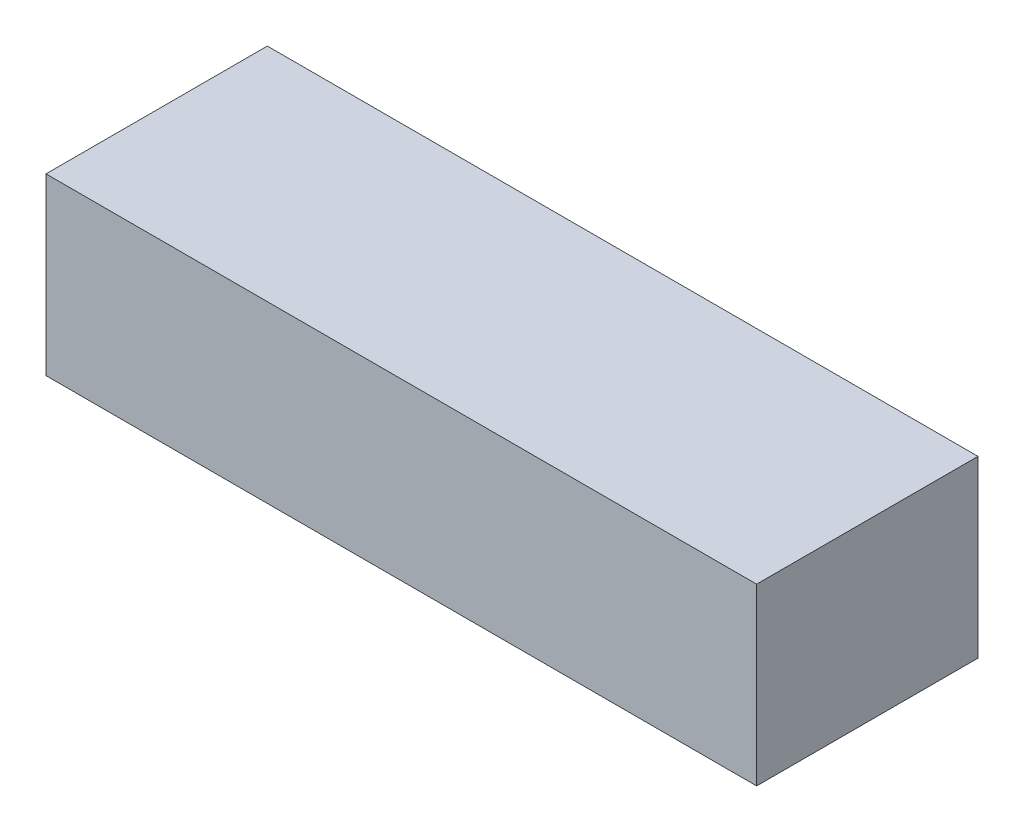
ISO-10303-21;
HEADER;
FILE_DESCRIPTION(('STEP AP214'),'2;1');
FILE_NAME('part.step','',(''),(''),'','','');
FILE_SCHEMA(('AUTOMOTIVE_DESIGN { 1 0 10303 214 1 1 1 1 }'));
ENDSEC;
DATA;
#1=APPLICATION_CONTEXT('core data for automotive mechanical design processes');
#2=APPLICATION_PROTOCOL_DEFINITION('international standard','automotive_design',2000,#1);
#3=PRODUCT_CONTEXT('',#1,'mechanical');
#4=PRODUCT('Part','Part','',(#3));
#5=PRODUCT_RELATED_PRODUCT_CATEGORY('part','',(#4));
#6=PRODUCT_DEFINITION_FORMATION('','',#4);
#7=PRODUCT_DEFINITION_CONTEXT('part definition',#1,'design');
#8=PRODUCT_DEFINITION('design','',#6,#7);
#9=PRODUCT_DEFINITION_SHAPE('','',#8);
#10=(LENGTH_UNIT() NAMED_UNIT(*) SI_UNIT(.MILLI.,.METRE.));
#11=(NAMED_UNIT(*) PLANE_ANGLE_UNIT() SI_UNIT($,.RADIAN.));
#12=(NAMED_UNIT(*) SI_UNIT($,.STERADIAN.) SOLID_ANGLE_UNIT());
#13=UNCERTAINTY_MEASURE_WITH_UNIT(LENGTH_MEASURE(1.E-05),#10,'distance_accuracy_value','');
#14=(GEOMETRIC_REPRESENTATION_CONTEXT(3) GLOBAL_UNCERTAINTY_ASSIGNED_CONTEXT((#13)) GLOBAL_UNIT_ASSIGNED_CONTEXT((#10,
#11,#12)) REPRESENTATION_CONTEXT('',''));
#15=CARTESIAN_POINT('',(0.,0.,0.));
#16=DIRECTION('',(0.,0.,1.));
#17=DIRECTION('',(1.,0.,0.));
#18=AXIS2_PLACEMENT_3D('',#15,#16,#17);
#19=CARTESIAN_POINT('',(61.,7.5,-9.5));
#20=DIRECTION('',(0.,0.,1.));
#21=DIRECTION('',(1.,0.,0.));
#22=AXIS2_PLACEMENT_3D('',#19,#20,#21);
#23=PLANE('',#22);
#24=DIRECTION('',(0.,1.,0.));
#25=VECTOR('',#24,1.);
#26=CARTESIAN_POINT('',(0.,7.5,-9.5));
#27=LINE('',#26,#25);
#28=CARTESIAN_POINT('',(0.,-7.5,-9.5));
#29=VERTEX_POINT('',#28);
#30=CARTESIAN_POINT('',(0.,7.5,-9.5));
#31=VERTEX_POINT('',#30);
#32=EDGE_CURVE('E113',#29,#31,#27,.T.);
#33=ORIENTED_EDGE('',*,*,#32,.T.);
#34=DIRECTION('',(-1.,0.,0.));
#35=VECTOR('',#34,1.);
#36=CARTESIAN_POINT('',(61.,7.5,-9.5));
#37=LINE('',#36,#35);
#38=CARTESIAN_POINT('',(61.,7.5,-9.5));
#39=VERTEX_POINT('',#38);
#40=EDGE_CURVE('E11',#39,#31,#37,.T.);
#41=ORIENTED_EDGE('',*,*,#40,.F.);
#42=DIRECTION('',(0.,1.,0.));
#43=VECTOR('',#42,1.);
#44=CARTESIAN_POINT('',(61.,7.5,-9.5));
#45=LINE('',#44,#43);
#46=CARTESIAN_POINT('',(61.,-7.5,-9.5));
#47=VERTEX_POINT('',#46);
#48=EDGE_CURVE('E97',#47,#39,#45,.T.);
#49=ORIENTED_EDGE('',*,*,#48,.F.);
#50=DIRECTION('',(-1.,0.,0.));
#51=VECTOR('',#50,1.);
#52=CARTESIAN_POINT('',(61.,-7.5,-9.5));
#53=LINE('',#52,#51);
#54=EDGE_CURVE('E109',#47,#29,#53,.T.);
#55=ORIENTED_EDGE('',*,*,#54,.T.);
#56=EDGE_LOOP('',(#33,#41,#49,#55));
#57=FACE_BOUND('',#56,.T.);
#58=ADVANCED_FACE('F45',(#57),#23,.F.);
#59=CARTESIAN_POINT('',(61.,7.5,9.5));
#60=DIRECTION('',(0.,-1.,0.));
#61=DIRECTION('',(0.,0.,-1.));
#62=AXIS2_PLACEMENT_3D('',#59,#60,#61);
#63=PLANE('',#62);
#64=DIRECTION('',(0.,0.,1.));
#65=VECTOR('',#64,1.);
#66=CARTESIAN_POINT('',(0.,7.5,9.5));
#67=LINE('',#66,#65);
#68=CARTESIAN_POINT('',(0.,7.5,9.5));
#69=VERTEX_POINT('',#68);
#70=EDGE_CURVE('E102',#31,#69,#67,.T.);
#71=ORIENTED_EDGE('',*,*,#70,.T.);
#72=DIRECTION('',(-1.,0.,0.));
#73=VECTOR('',#72,1.);
#74=CARTESIAN_POINT('',(61.,7.5,9.5));
#75=LINE('',#74,#73);
#76=CARTESIAN_POINT('',(61.,7.5,9.5));
#77=VERTEX_POINT('',#76);
#78=EDGE_CURVE('E54',#77,#69,#75,.T.);
#79=ORIENTED_EDGE('',*,*,#78,.F.);
#80=DIRECTION('',(0.,0.,1.));
#81=VECTOR('',#80,1.);
#82=CARTESIAN_POINT('',(61.,7.5,9.5));
#83=LINE('',#82,#81);
#84=EDGE_CURVE('E92',#39,#77,#83,.T.);
#85=ORIENTED_EDGE('',*,*,#84,.F.);
#86=ORIENTED_EDGE('',*,*,#40,.T.);
#87=EDGE_LOOP('',(#71,#79,#85,#86));
#88=FACE_BOUND('',#87,.T.);
#89=ADVANCED_FACE('F101',(#88),#63,.F.);
#90=CARTESIAN_POINT('',(61.,7.5,9.5));
#91=DIRECTION('',(0.,0.,-1.));
#92=DIRECTION('',(0.,1.,0.));
#93=AXIS2_PLACEMENT_3D('',#90,#91,#92);
#94=PLANE('',#93);
#95=DIRECTION('',(0.,-1.,0.));
#96=VECTOR('',#95,1.);
#97=CARTESIAN_POINT('',(0.,7.5,9.5));
#98=LINE('',#97,#96);
#99=CARTESIAN_POINT('',(0.,-7.5,9.49999999999999));
#100=VERTEX_POINT('',#99);
#101=EDGE_CURVE('E79',#69,#100,#98,.T.);
#102=ORIENTED_EDGE('',*,*,#101,.T.);
#103=DIRECTION('',(-1.,0.,0.));
#104=VECTOR('',#103,1.);
#105=CARTESIAN_POINT('',(61.,-7.5,9.49999999999999));
#106=LINE('',#105,#104);
#107=CARTESIAN_POINT('',(61.,-7.5,9.49999999999999));
#108=VERTEX_POINT('',#107);
#109=EDGE_CURVE('E104',#108,#100,#106,.T.);
#110=ORIENTED_EDGE('',*,*,#109,.F.);
#111=DIRECTION('',(0.,-1.,0.));
#112=VECTOR('',#111,1.);
#113=CARTESIAN_POINT('',(61.,7.5,9.5));
#114=LINE('',#113,#112);
#115=EDGE_CURVE('E95',#77,#108,#114,.T.);
#116=ORIENTED_EDGE('',*,*,#115,.F.);
#117=ORIENTED_EDGE('',*,*,#78,.T.);
#118=EDGE_LOOP('',(#102,#110,#116,#117));
#119=FACE_BOUND('',#118,.T.);
#120=ADVANCED_FACE('F105',(#119),#94,.F.);
#121=CARTESIAN_POINT('',(61.,-7.5,9.49999999999999));
#122=DIRECTION('',(0.,1.,0.));
#123=DIRECTION('',(0.,0.,1.));
#124=AXIS2_PLACEMENT_3D('',#121,#122,#123);
#125=PLANE('',#124);
#126=DIRECTION('',(0.,0.,-1.));
#127=VECTOR('',#126,1.);
#128=CARTESIAN_POINT('',(0.,-7.5,9.49999999999999));
#129=LINE('',#128,#127);
#130=EDGE_CURVE('E85',#100,#29,#129,.T.);
#131=ORIENTED_EDGE('',*,*,#130,.T.);
#132=ORIENTED_EDGE('',*,*,#54,.F.);
#133=DIRECTION('',(0.,0.,-1.));
#134=VECTOR('',#133,1.);
#135=CARTESIAN_POINT('',(61.,-7.5,9.49999999999999));
#136=LINE('',#135,#134);
#137=EDGE_CURVE('E62',#108,#47,#136,.T.);
#138=ORIENTED_EDGE('',*,*,#137,.F.);
#139=ORIENTED_EDGE('',*,*,#109,.T.);
#140=EDGE_LOOP('',(#131,#132,#138,#139));
#141=FACE_BOUND('',#140,.T.);
#142=ADVANCED_FACE('F126',(#141),#125,.F.);
#143=CARTESIAN_POINT('',(61.,0.,0.));
#144=DIRECTION('',(1.,0.,0.));
#145=DIRECTION('',(0.,0.,-1.));
#146=AXIS2_PLACEMENT_3D('',#143,#144,#145);
#147=PLANE('',#146);
#148=ORIENTED_EDGE('',*,*,#48,.T.);
#149=ORIENTED_EDGE('',*,*,#84,.T.);
#150=ORIENTED_EDGE('',*,*,#115,.T.);
#151=ORIENTED_EDGE('',*,*,#137,.T.);
#152=EDGE_LOOP('',(#148,#149,#150,#151));
#153=FACE_BOUND('',#152,.T.);
#154=ADVANCED_FACE('F93',(#153),#147,.T.);
#155=CARTESIAN_POINT('',(0.,0.,0.));
#156=DIRECTION('',(1.,0.,0.));
#157=DIRECTION('',(0.,0.,-1.));
#158=AXIS2_PLACEMENT_3D('',#155,#156,#157);
#159=PLANE('',#158);
#160=ORIENTED_EDGE('',*,*,#32,.F.);
#161=ORIENTED_EDGE('',*,*,#130,.F.);
#162=ORIENTED_EDGE('',*,*,#101,.F.);
#163=ORIENTED_EDGE('',*,*,#70,.F.);
#164=EDGE_LOOP('',(#160,#161,#162,#163));
#165=FACE_BOUND('',#164,.T.);
#166=ADVANCED_FACE('F129',(#165),#159,.F.);
#167=CLOSED_SHELL('',(#58,#89,#120,#142,#154,#166));
#168=MANIFOLD_SOLID_BREP('B2',#167);
#169=ADVANCED_BREP_SHAPE_REPRESENTATION('',(#18,#168),#14);
#170=SHAPE_DEFINITION_REPRESENTATION(#9,#169);
ENDSEC;
END-ISO-10303-21;
